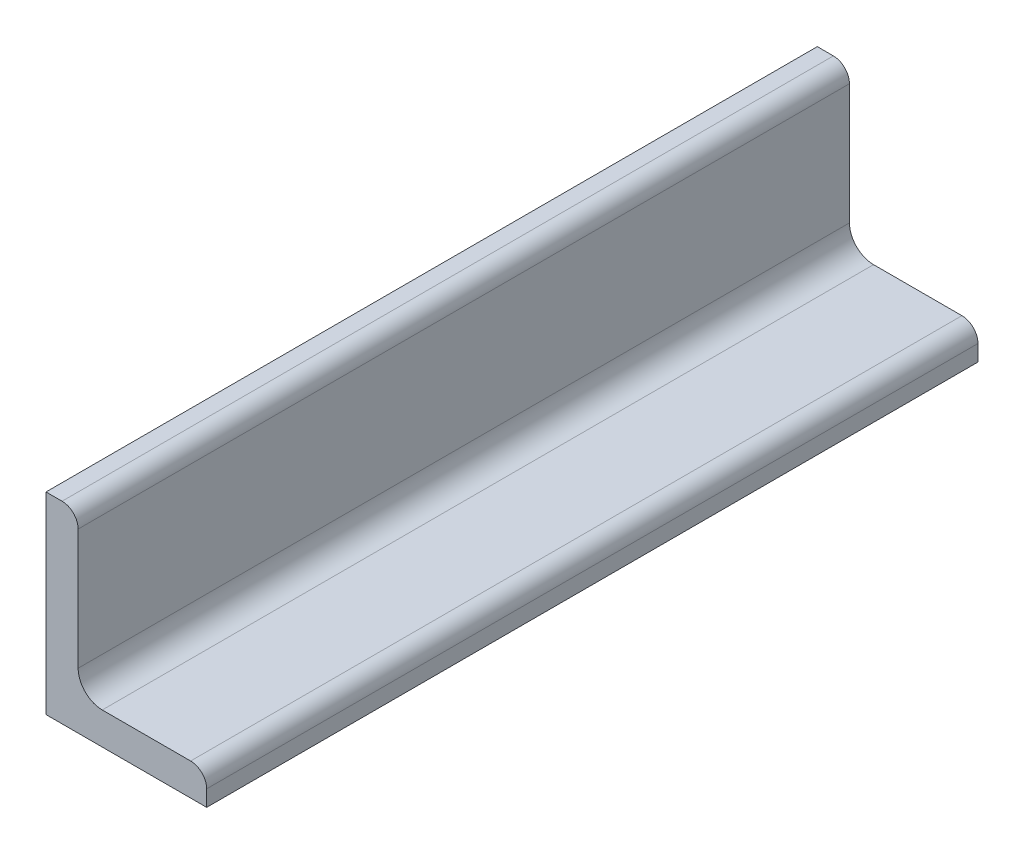
ISO-10303-21;
HEADER;
FILE_DESCRIPTION(('STEP AP214'),'2;1');
FILE_NAME('part.step','',(''),(''),'','','');
FILE_SCHEMA(('AUTOMOTIVE_DESIGN { 1 0 10303 214 1 1 1 1 }'));
ENDSEC;
DATA;
#1=APPLICATION_CONTEXT('core data for automotive mechanical design processes');
#2=APPLICATION_PROTOCOL_DEFINITION('international standard','automotive_design',2000,#1);
#3=PRODUCT_CONTEXT('',#1,'mechanical');
#4=PRODUCT('Part','Part','',(#3));
#5=PRODUCT_RELATED_PRODUCT_CATEGORY('part','',(#4));
#6=PRODUCT_DEFINITION_FORMATION('','',#4);
#7=PRODUCT_DEFINITION_CONTEXT('part definition',#1,'design');
#8=PRODUCT_DEFINITION('design','',#6,#7);
#9=PRODUCT_DEFINITION_SHAPE('','',#8);
#10=(LENGTH_UNIT() NAMED_UNIT(*) SI_UNIT(.MILLI.,.METRE.));
#11=(NAMED_UNIT(*) PLANE_ANGLE_UNIT() SI_UNIT($,.RADIAN.));
#12=(NAMED_UNIT(*) SI_UNIT($,.STERADIAN.) SOLID_ANGLE_UNIT());
#13=UNCERTAINTY_MEASURE_WITH_UNIT(LENGTH_MEASURE(1.E-05),#10,'distance_accuracy_value','');
#14=(GEOMETRIC_REPRESENTATION_CONTEXT(3) GLOBAL_UNCERTAINTY_ASSIGNED_CONTEXT((#13)) GLOBAL_UNIT_ASSIGNED_CONTEXT((#10,
#11,#12)) REPRESENTATION_CONTEXT('',''));
#15=CARTESIAN_POINT('',(0.,0.,0.));
#16=DIRECTION('',(0.,0.,1.));
#17=DIRECTION('',(1.,0.,0.));
#18=AXIS2_PLACEMENT_3D('',#15,#16,#17);
#19=CARTESIAN_POINT('',(0.897927251325018,76.2882459217981,304.8));
#20=DIRECTION('',(1.,0.,0.));
#21=DIRECTION('',(0.,0.,-1.));
#22=AXIS2_PLACEMENT_3D('',#19,#20,#21);
#23=PLANE('',#22);
#24=DIRECTION('',(0.,-1.,0.));
#25=VECTOR('',#24,1.);
#26=CARTESIAN_POINT('',(0.897927251325018,76.2882459217981,0.));
#27=LINE('',#26,#25);
#28=CARTESIAN_POINT('',(0.897927251325018,76.2882459217981,0.));
#29=VERTEX_POINT('',#28);
#30=CARTESIAN_POINT('',(0.897927251325018,0.0882459217980795,0.));
#31=VERTEX_POINT('',#30);
#32=EDGE_CURVE('E135',#29,#31,#27,.T.);
#33=ORIENTED_EDGE('',*,*,#32,.T.);
#34=DIRECTION('',(0.,0.,-1.));
#35=VECTOR('',#34,1.);
#36=CARTESIAN_POINT('',(0.897927251325018,0.0882459217980795,304.8));
#37=LINE('',#36,#35);
#38=CARTESIAN_POINT('',(0.897927251325018,0.0882459217980795,304.8));
#39=VERTEX_POINT('',#38);
#40=EDGE_CURVE('E11',#39,#31,#37,.T.);
#41=ORIENTED_EDGE('',*,*,#40,.F.);
#42=DIRECTION('',(0.,-1.,0.));
#43=VECTOR('',#42,1.);
#44=CARTESIAN_POINT('',(0.897927251325018,76.2882459217981,304.8));
#45=LINE('',#44,#43);
#46=CARTESIAN_POINT('',(0.897927251325018,76.2882459217981,304.8));
#47=VERTEX_POINT('',#46);
#48=EDGE_CURVE('E151',#47,#39,#45,.T.);
#49=ORIENTED_EDGE('',*,*,#48,.F.);
#50=DIRECTION('',(0.,0.,-1.));
#51=VECTOR('',#50,1.);
#52=CARTESIAN_POINT('',(0.897927251325018,76.2882459217981,304.8));
#53=LINE('',#52,#51);
#54=EDGE_CURVE('E131',#47,#29,#53,.T.);
#55=ORIENTED_EDGE('',*,*,#54,.T.);
#56=EDGE_LOOP('',(#33,#41,#49,#55));
#57=FACE_BOUND('',#56,.T.);
#58=ADVANCED_FACE('F33',(#57),#23,.F.);
#59=CARTESIAN_POINT('',(0.897927251325018,0.0882459217980795,304.8));
#60=DIRECTION('',(0.,1.,0.));
#61=DIRECTION('',(0.,0.,1.));
#62=AXIS2_PLACEMENT_3D('',#59,#60,#61);
#63=PLANE('',#62);
#64=DIRECTION('',(1.,0.,0.));
#65=VECTOR('',#64,1.);
#66=CARTESIAN_POINT('',(0.897927251325018,0.0882459217980795,0.));
#67=LINE('',#66,#65);
#68=CARTESIAN_POINT('',(64.397927251325,0.0882459217980795,0.));
#69=VERTEX_POINT('',#68);
#70=EDGE_CURVE('E138',#31,#69,#67,.T.);
#71=ORIENTED_EDGE('',*,*,#70,.T.);
#72=DIRECTION('',(0.,0.,-1.));
#73=VECTOR('',#72,1.);
#74=CARTESIAN_POINT('',(64.397927251325,0.0882459217980795,304.8));
#75=LINE('',#74,#73);
#76=CARTESIAN_POINT('',(64.397927251325,0.0882459217980795,304.8));
#77=VERTEX_POINT('',#76);
#78=EDGE_CURVE('E41',#77,#69,#75,.T.);
#79=ORIENTED_EDGE('',*,*,#78,.F.);
#80=DIRECTION('',(1.,0.,0.));
#81=VECTOR('',#80,1.);
#82=CARTESIAN_POINT('',(0.897927251325018,0.0882459217980795,304.8));
#83=LINE('',#82,#81);
#84=EDGE_CURVE('E95',#39,#77,#83,.T.);
#85=ORIENTED_EDGE('',*,*,#84,.F.);
#86=ORIENTED_EDGE('',*,*,#40,.T.);
#87=EDGE_LOOP('',(#71,#79,#85,#86));
#88=FACE_BOUND('',#87,.T.);
#89=ADVANCED_FACE('F194',(#88),#63,.F.);
#90=CARTESIAN_POINT('',(64.397927251325,0.0882459217980795,304.8));
#91=DIRECTION('',(-1.,0.,0.));
#92=DIRECTION('',(0.,0.,1.));
#93=AXIS2_PLACEMENT_3D('',#90,#91,#92);
#94=PLANE('',#93);
#95=DIRECTION('',(0.,1.,0.));
#96=VECTOR('',#95,1.);
#97=CARTESIAN_POINT('',(64.397927251325,0.0882459217980795,0.));
#98=LINE('',#97,#96);
#99=CARTESIAN_POINT('',(64.397927251325,6.43824592179808,0.));
#100=VERTEX_POINT('',#99);
#101=EDGE_CURVE('E140',#69,#100,#98,.T.);
#102=ORIENTED_EDGE('',*,*,#101,.T.);
#103=DIRECTION('',(0.,0.,-1.));
#104=VECTOR('',#103,1.);
#105=CARTESIAN_POINT('',(64.397927251325,6.43824592179808,304.8));
#106=LINE('',#105,#104);
#107=CARTESIAN_POINT('',(64.397927251325,6.43824592179808,304.8));
#108=VERTEX_POINT('',#107);
#109=EDGE_CURVE('E161',#108,#100,#106,.T.);
#110=ORIENTED_EDGE('',*,*,#109,.F.);
#111=DIRECTION('',(0.,1.,0.));
#112=VECTOR('',#111,1.);
#113=CARTESIAN_POINT('',(64.397927251325,0.0882459217980795,304.8));
#114=LINE('',#113,#112);
#115=EDGE_CURVE('E169',#77,#108,#114,.T.);
#116=ORIENTED_EDGE('',*,*,#115,.F.);
#117=ORIENTED_EDGE('',*,*,#78,.T.);
#118=EDGE_LOOP('',(#102,#110,#116,#117));
#119=FACE_BOUND('',#118,.T.);
#120=ADVANCED_FACE('F167',(#119),#94,.F.);
#121=CARTESIAN_POINT('',(58.047927251325,6.43824592179808,304.8));
#122=DIRECTION('',(0.,0.,-1.));
#123=DIRECTION('',(-1.,0.,0.));
#124=AXIS2_PLACEMENT_3D('',#121,#122,#123);
#125=CYLINDRICAL_SURFACE('',#124,6.35);
#126=CARTESIAN_POINT('',(58.047927251325,6.43824592179808,0.));
#127=DIRECTION('',(0.,0.,1.));
#128=DIRECTION('',(1.,0.,0.));
#129=AXIS2_PLACEMENT_3D('',#126,#127,#128);
#130=CIRCLE('',#129,6.35);
#131=CARTESIAN_POINT('',(58.047927251325,12.7882459217981,0.));
#132=VERTEX_POINT('',#131);
#133=EDGE_CURVE('E142',#100,#132,#130,.T.);
#134=ORIENTED_EDGE('',*,*,#133,.T.);
#135=DIRECTION('',(0.,0.,-1.));
#136=VECTOR('',#135,1.);
#137=CARTESIAN_POINT('',(58.047927251325,12.7882459217981,304.8));
#138=LINE('',#137,#136);
#139=CARTESIAN_POINT('',(58.047927251325,12.7882459217981,304.8));
#140=VERTEX_POINT('',#139);
#141=EDGE_CURVE('E158',#140,#132,#138,.T.);
#142=ORIENTED_EDGE('',*,*,#141,.F.);
#143=CARTESIAN_POINT('',(58.047927251325,6.43824592179808,304.8));
#144=DIRECTION('',(0.,0.,1.));
#145=DIRECTION('',(1.,0.,0.));
#146=AXIS2_PLACEMENT_3D('',#143,#144,#145);
#147=CIRCLE('',#146,6.35);
#148=EDGE_CURVE('E185',#108,#140,#147,.T.);
#149=ORIENTED_EDGE('',*,*,#148,.F.);
#150=ORIENTED_EDGE('',*,*,#109,.T.);
#151=EDGE_LOOP('',(#134,#142,#149,#150));
#152=FACE_BOUND('',#151,.T.);
#153=ADVANCED_FACE('F178',(#152),#125,.T.);
#154=CARTESIAN_POINT('',(58.047927251325,12.7882459217981,304.8));
#155=DIRECTION('',(0.,-1.,0.));
#156=DIRECTION('',(0.,0.,-1.));
#157=AXIS2_PLACEMENT_3D('',#154,#155,#156);
#158=PLANE('',#157);
#159=DIRECTION('',(-1.,0.,0.));
#160=VECTOR('',#159,1.);
#161=CARTESIAN_POINT('',(58.047927251325,12.7882459217981,0.));
#162=LINE('',#161,#160);
#163=CARTESIAN_POINT('',(23.122927251325,12.7882459217981,0.));
#164=VERTEX_POINT('',#163);
#165=EDGE_CURVE('E144',#132,#164,#162,.T.);
#166=ORIENTED_EDGE('',*,*,#165,.T.);
#167=DIRECTION('',(0.,0.,-1.));
#168=VECTOR('',#167,1.);
#169=CARTESIAN_POINT('',(23.122927251325,12.7882459217981,304.8));
#170=LINE('',#169,#168);
#171=CARTESIAN_POINT('',(23.122927251325,12.7882459217981,304.8));
#172=VERTEX_POINT('',#171);
#173=EDGE_CURVE('E155',#172,#164,#170,.T.);
#174=ORIENTED_EDGE('',*,*,#173,.F.);
#175=DIRECTION('',(-1.,0.,0.));
#176=VECTOR('',#175,1.);
#177=CARTESIAN_POINT('',(58.047927251325,12.7882459217981,304.8));
#178=LINE('',#177,#176);
#179=EDGE_CURVE('E184',#140,#172,#178,.T.);
#180=ORIENTED_EDGE('',*,*,#179,.F.);
#181=ORIENTED_EDGE('',*,*,#141,.T.);
#182=EDGE_LOOP('',(#166,#174,#180,#181));
#183=FACE_BOUND('',#182,.T.);
#184=ADVANCED_FACE('F182',(#183),#158,.F.);
#185=CARTESIAN_POINT('',(23.122927251325,22.3132459217981,304.8));
#186=DIRECTION('',(0.,0.,-1.));
#187=DIRECTION('',(-1.,0.,0.));
#188=AXIS2_PLACEMENT_3D('',#185,#186,#187);
#189=CYLINDRICAL_SURFACE('',#188,9.52499999999999);
#190=CARTESIAN_POINT('',(23.122927251325,22.3132459217981,0.));
#191=DIRECTION('',(0.,0.,-1.));
#192=DIRECTION('',(1.,0.,0.));
#193=AXIS2_PLACEMENT_3D('',#190,#191,#192);
#194=CIRCLE('',#193,9.52499999999999);
#195=CARTESIAN_POINT('',(13.597927251325,22.3132459217981,0.));
#196=VERTEX_POINT('',#195);
#197=EDGE_CURVE('E146',#164,#196,#194,.T.);
#198=ORIENTED_EDGE('',*,*,#197,.T.);
#199=DIRECTION('',(0.,0.,-1.));
#200=VECTOR('',#199,1.);
#201=CARTESIAN_POINT('',(13.597927251325,22.3132459217981,304.8));
#202=LINE('',#201,#200);
#203=CARTESIAN_POINT('',(13.597927251325,22.3132459217981,304.8));
#204=VERTEX_POINT('',#203);
#205=EDGE_CURVE('E126',#204,#196,#202,.T.);
#206=ORIENTED_EDGE('',*,*,#205,.F.);
#207=CARTESIAN_POINT('',(23.122927251325,22.3132459217981,304.8));
#208=DIRECTION('',(0.,0.,-1.));
#209=DIRECTION('',(1.,0.,0.));
#210=AXIS2_PLACEMENT_3D('',#207,#208,#209);
#211=CIRCLE('',#210,9.52499999999999);
#212=EDGE_CURVE('E117',#172,#204,#211,.T.);
#213=ORIENTED_EDGE('',*,*,#212,.F.);
#214=ORIENTED_EDGE('',*,*,#173,.T.);
#215=EDGE_LOOP('',(#198,#206,#213,#214));
#216=FACE_BOUND('',#215,.T.);
#217=ADVANCED_FACE('F206',(#216),#189,.F.);
#218=CARTESIAN_POINT('',(13.597927251325,22.3132459217981,304.8));
#219=DIRECTION('',(-1.,0.,0.));
#220=DIRECTION('',(0.,0.,1.));
#221=AXIS2_PLACEMENT_3D('',#218,#219,#220);
#222=PLANE('',#221);
#223=DIRECTION('',(0.,1.,0.));
#224=VECTOR('',#223,1.);
#225=CARTESIAN_POINT('',(13.597927251325,22.3132459217981,0.));
#226=LINE('',#225,#224);
#227=CARTESIAN_POINT('',(13.597927251325,69.9382459217981,0.));
#228=VERTEX_POINT('',#227);
#229=EDGE_CURVE('E125',#196,#228,#226,.T.);
#230=ORIENTED_EDGE('',*,*,#229,.T.);
#231=DIRECTION('',(0.,0.,-1.));
#232=VECTOR('',#231,1.);
#233=CARTESIAN_POINT('',(13.597927251325,69.9382459217981,304.8));
#234=LINE('',#233,#232);
#235=CARTESIAN_POINT('',(13.597927251325,69.9382459217981,304.8));
#236=VERTEX_POINT('',#235);
#237=EDGE_CURVE('E122',#236,#228,#234,.T.);
#238=ORIENTED_EDGE('',*,*,#237,.F.);
#239=DIRECTION('',(0.,1.,0.));
#240=VECTOR('',#239,1.);
#241=CARTESIAN_POINT('',(13.597927251325,22.3132459217981,304.8));
#242=LINE('',#241,#240);
#243=EDGE_CURVE('E111',#204,#236,#242,.T.);
#244=ORIENTED_EDGE('',*,*,#243,.F.);
#245=ORIENTED_EDGE('',*,*,#205,.T.);
#246=EDGE_LOOP('',(#230,#238,#244,#245));
#247=FACE_BOUND('',#246,.T.);
#248=ADVANCED_FACE('F123',(#247),#222,.F.);
#249=CARTESIAN_POINT('',(7.24792725132502,69.9382459217981,304.8));
#250=DIRECTION('',(0.,0.,-1.));
#251=DIRECTION('',(-1.,0.,0.));
#252=AXIS2_PLACEMENT_3D('',#249,#250,#251);
#253=CYLINDRICAL_SURFACE('',#252,6.35);
#254=CARTESIAN_POINT('',(7.24792725132502,69.9382459217981,0.));
#255=DIRECTION('',(0.,0.,1.));
#256=DIRECTION('',(1.,0.,0.));
#257=AXIS2_PLACEMENT_3D('',#254,#255,#256);
#258=CIRCLE('',#257,6.35);
#259=CARTESIAN_POINT('',(7.24792725132502,76.2882459217981,0.));
#260=VERTEX_POINT('',#259);
#261=EDGE_CURVE('E81',#228,#260,#258,.T.);
#262=ORIENTED_EDGE('',*,*,#261,.T.);
#263=DIRECTION('',(0.,0.,-1.));
#264=VECTOR('',#263,1.);
#265=CARTESIAN_POINT('',(7.24792725132502,76.2882459217981,304.8));
#266=LINE('',#265,#264);
#267=CARTESIAN_POINT('',(7.24792725132502,76.2882459217981,304.8));
#268=VERTEX_POINT('',#267);
#269=EDGE_CURVE('E127',#268,#260,#266,.T.);
#270=ORIENTED_EDGE('',*,*,#269,.F.);
#271=CARTESIAN_POINT('',(7.24792725132502,69.9382459217981,304.8));
#272=DIRECTION('',(0.,0.,1.));
#273=DIRECTION('',(1.,0.,0.));
#274=AXIS2_PLACEMENT_3D('',#271,#272,#273);
#275=CIRCLE('',#274,6.35);
#276=EDGE_CURVE('E115',#236,#268,#275,.T.);
#277=ORIENTED_EDGE('',*,*,#276,.F.);
#278=ORIENTED_EDGE('',*,*,#237,.T.);
#279=EDGE_LOOP('',(#262,#270,#277,#278));
#280=FACE_BOUND('',#279,.T.);
#281=ADVANCED_FACE('F129',(#280),#253,.T.);
#282=CARTESIAN_POINT('',(7.24792725132502,76.2882459217981,304.8));
#283=DIRECTION('',(0.,-1.,0.));
#284=DIRECTION('',(0.,0.,-1.));
#285=AXIS2_PLACEMENT_3D('',#282,#283,#284);
#286=PLANE('',#285);
#287=DIRECTION('',(-1.,0.,0.));
#288=VECTOR('',#287,1.);
#289=CARTESIAN_POINT('',(7.24792725132502,76.2882459217981,0.));
#290=LINE('',#289,#288);
#291=EDGE_CURVE('E87',#260,#29,#290,.T.);
#292=ORIENTED_EDGE('',*,*,#291,.T.);
#293=ORIENTED_EDGE('',*,*,#54,.F.);
#294=DIRECTION('',(-1.,0.,0.));
#295=VECTOR('',#294,1.);
#296=CARTESIAN_POINT('',(7.24792725132502,76.2882459217981,304.8));
#297=LINE('',#296,#295);
#298=EDGE_CURVE('E49',#268,#47,#297,.T.);
#299=ORIENTED_EDGE('',*,*,#298,.F.);
#300=ORIENTED_EDGE('',*,*,#269,.T.);
#301=EDGE_LOOP('',(#292,#293,#299,#300));
#302=FACE_BOUND('',#301,.T.);
#303=ADVANCED_FACE('F214',(#302),#286,.F.);
#304=CARTESIAN_POINT('',(58.047927251325,6.43824592179808,304.8));
#305=DIRECTION('',(0.,0.,1.));
#306=DIRECTION('',(1.,0.,0.));
#307=AXIS2_PLACEMENT_3D('',#304,#305,#306);
#308=PLANE('',#307);
#309=ORIENTED_EDGE('',*,*,#48,.T.);
#310=ORIENTED_EDGE('',*,*,#84,.T.);
#311=ORIENTED_EDGE('',*,*,#115,.T.);
#312=ORIENTED_EDGE('',*,*,#148,.T.);
#313=ORIENTED_EDGE('',*,*,#179,.T.);
#314=ORIENTED_EDGE('',*,*,#212,.T.);
#315=ORIENTED_EDGE('',*,*,#243,.T.);
#316=ORIENTED_EDGE('',*,*,#276,.T.);
#317=ORIENTED_EDGE('',*,*,#298,.T.);
#318=EDGE_LOOP('',(#309,#310,#311,#312,#313,#314,#315,#316,#317));
#319=FACE_BOUND('',#318,.T.);
#320=ADVANCED_FACE('F113',(#319),#308,.T.);
#321=CARTESIAN_POINT('',(58.047927251325,6.43824592179808,0.));
#322=DIRECTION('',(0.,0.,1.));
#323=DIRECTION('',(1.,0.,0.));
#324=AXIS2_PLACEMENT_3D('',#321,#322,#323);
#325=PLANE('',#324);
#326=ORIENTED_EDGE('',*,*,#32,.F.);
#327=ORIENTED_EDGE('',*,*,#291,.F.);
#328=ORIENTED_EDGE('',*,*,#261,.F.);
#329=ORIENTED_EDGE('',*,*,#229,.F.);
#330=ORIENTED_EDGE('',*,*,#197,.F.);
#331=ORIENTED_EDGE('',*,*,#165,.F.);
#332=ORIENTED_EDGE('',*,*,#133,.F.);
#333=ORIENTED_EDGE('',*,*,#101,.F.);
#334=ORIENTED_EDGE('',*,*,#70,.F.);
#335=EDGE_LOOP('',(#326,#327,#328,#329,#330,#331,#332,#333,#334));
#336=FACE_BOUND('',#335,.T.);
#337=ADVANCED_FACE('F173',(#336),#325,.F.);
#338=CLOSED_SHELL('',(#58,#89,#120,#153,#184,#217,#248,#281,#303,#320,#337));
#339=MANIFOLD_SOLID_BREP('B2',#338);
#340=ADVANCED_BREP_SHAPE_REPRESENTATION('',(#18,#339),#14);
#341=SHAPE_DEFINITION_REPRESENTATION(#9,#340);
ENDSEC;
END-ISO-10303-21;
